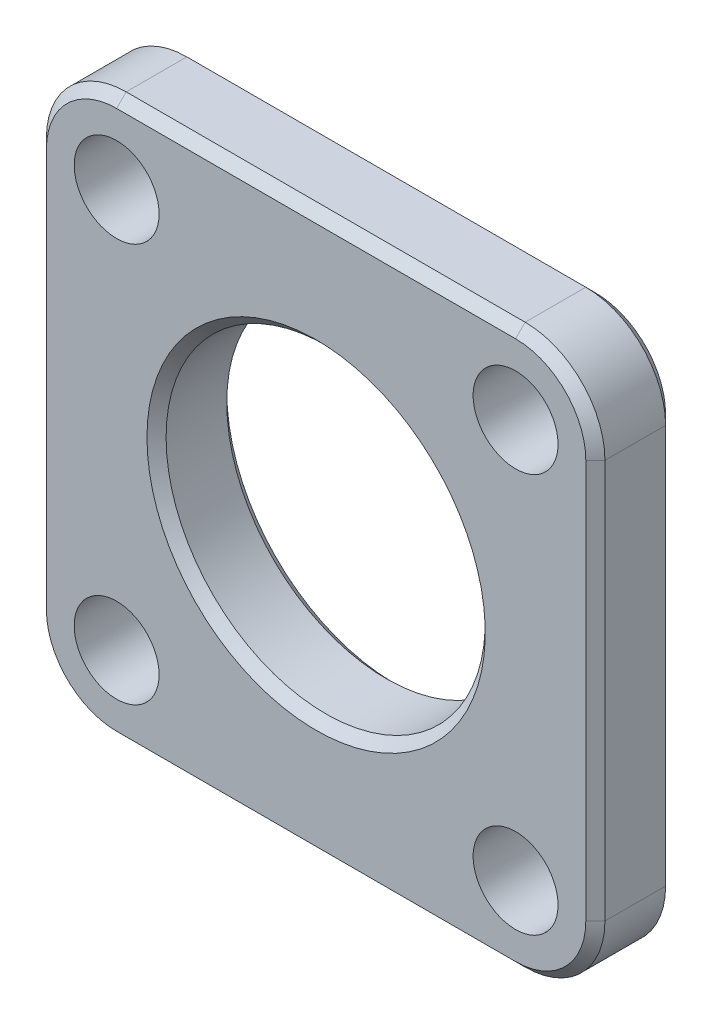
ISO-10303-21;
HEADER;
FILE_DESCRIPTION(('STEP AP214'),'2;1');
FILE_NAME('part.step','',(''),(''),'','','');
FILE_SCHEMA(('AUTOMOTIVE_DESIGN { 1 0 10303 214 1 1 1 1 }'));
ENDSEC;
DATA;
#1=APPLICATION_CONTEXT('core data for automotive mechanical design processes');
#2=APPLICATION_PROTOCOL_DEFINITION('international standard','automotive_design',2000,#1);
#3=PRODUCT_CONTEXT('',#1,'mechanical');
#4=PRODUCT('Part','Part','',(#3));
#5=PRODUCT_RELATED_PRODUCT_CATEGORY('part','',(#4));
#6=PRODUCT_DEFINITION_FORMATION('','',#4);
#7=PRODUCT_DEFINITION_CONTEXT('part definition',#1,'design');
#8=PRODUCT_DEFINITION('design','',#6,#7);
#9=PRODUCT_DEFINITION_SHAPE('','',#8);
#10=(LENGTH_UNIT() NAMED_UNIT(*) SI_UNIT(.MILLI.,.METRE.));
#11=(NAMED_UNIT(*) PLANE_ANGLE_UNIT() SI_UNIT($,.RADIAN.));
#12=(NAMED_UNIT(*) SI_UNIT($,.STERADIAN.) SOLID_ANGLE_UNIT());
#13=UNCERTAINTY_MEASURE_WITH_UNIT(LENGTH_MEASURE(1.E-05),#10,'distance_accuracy_value','');
#14=(GEOMETRIC_REPRESENTATION_CONTEXT(3) GLOBAL_UNCERTAINTY_ASSIGNED_CONTEXT((#13)) GLOBAL_UNIT_ASSIGNED_CONTEXT((#10,
#11,#12)) REPRESENTATION_CONTEXT('',''));
#15=CARTESIAN_POINT('',(0.,0.,0.));
#16=DIRECTION('',(0.,0.,1.));
#17=DIRECTION('',(1.,0.,0.));
#18=AXIS2_PLACEMENT_3D('',#15,#16,#17);
#19=CARTESIAN_POINT('',(-15.875,-15.875,6.35));
#20=DIRECTION('',(0.,0.,-1.));
#21=DIRECTION('',(-1.,0.,0.));
#22=AXIS2_PLACEMENT_3D('',#19,#20,#21);
#23=PLANE('',#22);
#24=CARTESIAN_POINT('',(-15.875,-15.875,6.35));
#25=DIRECTION('',(0.,0.,-1.));
#26=DIRECTION('',(-1.,0.,0.));
#27=AXIS2_PLACEMENT_3D('',#24,#25,#26);
#28=CIRCLE('',#27,5.588);
#29=CARTESIAN_POINT('',(-21.463,-15.875,6.35));
#30=VERTEX_POINT('',#29);
#31=CARTESIAN_POINT('',(-15.875,-21.463,6.35));
#32=VERTEX_POINT('',#31);
#33=EDGE_CURVE('E59',#30,#32,#28,.F.);
#34=ORIENTED_EDGE('',*,*,#33,.T.);
#35=DIRECTION('',(1.,0.,0.));
#36=VECTOR('',#35,1.);
#37=CARTESIAN_POINT('',(-15.875,-21.463,6.35));
#38=LINE('',#37,#36);
#39=CARTESIAN_POINT('',(15.875,-21.463,6.35));
#40=VERTEX_POINT('',#39);
#41=EDGE_CURVE('E345',#32,#40,#38,.T.);
#42=ORIENTED_EDGE('',*,*,#41,.T.);
#43=CARTESIAN_POINT('',(15.875,-15.875,6.35));
#44=DIRECTION('',(0.,0.,-1.));
#45=DIRECTION('',(-1.,0.,0.));
#46=AXIS2_PLACEMENT_3D('',#43,#44,#45);
#47=CIRCLE('',#46,5.588);
#48=CARTESIAN_POINT('',(21.463,-15.875,6.35));
#49=VERTEX_POINT('',#48);
#50=EDGE_CURVE('E181',#40,#49,#47,.F.);
#51=ORIENTED_EDGE('',*,*,#50,.T.);
#52=DIRECTION('',(0.,1.,0.));
#53=VECTOR('',#52,1.);
#54=CARTESIAN_POINT('',(21.463,-15.875,6.35));
#55=LINE('',#54,#53);
#56=CARTESIAN_POINT('',(21.463,15.875,6.35));
#57=VERTEX_POINT('',#56);
#58=EDGE_CURVE('E341',#49,#57,#55,.T.);
#59=ORIENTED_EDGE('',*,*,#58,.T.);
#60=CARTESIAN_POINT('',(15.875,15.875,6.35));
#61=DIRECTION('',(0.,0.,-1.));
#62=DIRECTION('',(-1.,0.,0.));
#63=AXIS2_PLACEMENT_3D('',#60,#61,#62);
#64=CIRCLE('',#63,5.588);
#65=CARTESIAN_POINT('',(15.875,21.463,6.35));
#66=VERTEX_POINT('',#65);
#67=EDGE_CURVE('E337',#57,#66,#64,.F.);
#68=ORIENTED_EDGE('',*,*,#67,.T.);
#69=DIRECTION('',(-1.,0.,0.));
#70=VECTOR('',#69,1.);
#71=CARTESIAN_POINT('',(-15.875,21.463,6.35));
#72=LINE('',#71,#70);
#73=CARTESIAN_POINT('',(-15.875,21.463,6.35));
#74=VERTEX_POINT('',#73);
#75=EDGE_CURVE('E333',#66,#74,#72,.T.);
#76=ORIENTED_EDGE('',*,*,#75,.T.);
#77=CARTESIAN_POINT('',(-15.875,15.875,6.35));
#78=DIRECTION('',(0.,0.,-1.));
#79=DIRECTION('',(-1.,0.,0.));
#80=AXIS2_PLACEMENT_3D('',#77,#78,#79);
#81=CIRCLE('',#80,5.588);
#82=CARTESIAN_POINT('',(-21.463,15.875,6.35));
#83=VERTEX_POINT('',#82);
#84=EDGE_CURVE('E335',#74,#83,#81,.F.);
#85=ORIENTED_EDGE('',*,*,#84,.T.);
#86=DIRECTION('',(0.,-1.,0.));
#87=VECTOR('',#86,1.);
#88=CARTESIAN_POINT('',(-21.463,-15.875,6.35));
#89=LINE('',#88,#87);
#90=EDGE_CURVE('E339',#83,#30,#89,.T.);
#91=ORIENTED_EDGE('',*,*,#90,.T.);
#92=EDGE_LOOP('',(#34,#42,#51,#59,#68,#76,#85,#91));
#93=FACE_BOUND('',#92,.T.);
#94=CARTESIAN_POINT('',(0.,0.,6.35));
#95=DIRECTION('',(0.,0.,-1.));
#96=DIRECTION('',(-1.,0.,0.));
#97=AXIS2_PLACEMENT_3D('',#94,#95,#96);
#98=CIRCLE('',#97,13.462);
#99=CARTESIAN_POINT('',(-13.462,0.,6.35));
#100=VERTEX_POINT('',#99);
#101=EDGE_CURVE('E330',#100,#100,#98,.T.);
#102=ORIENTED_EDGE('',*,*,#101,.T.);
#103=EDGE_LOOP('',(#102));
#104=FACE_BOUND('',#103,.T.);
#105=CARTESIAN_POINT('',(-15.875,15.875,6.35));
#106=DIRECTION('',(0.,0.,1.));
#107=DIRECTION('',(1.,0.,0.));
#108=AXIS2_PLACEMENT_3D('',#105,#106,#107);
#109=CIRCLE('',#108,3.37819999999999);
#110=CARTESIAN_POINT('',(-12.4968,15.875,6.35));
#111=VERTEX_POINT('',#110);
#112=EDGE_CURVE('E237',#111,#111,#109,.T.);
#113=ORIENTED_EDGE('',*,*,#112,.F.);
#114=EDGE_LOOP('',(#113));
#115=FACE_BOUND('',#114,.T.);
#116=CARTESIAN_POINT('',(15.875,-15.875,6.35));
#117=DIRECTION('',(0.,0.,1.));
#118=DIRECTION('',(1.,0.,0.));
#119=AXIS2_PLACEMENT_3D('',#116,#117,#118);
#120=CIRCLE('',#119,3.37819999999999);
#121=CARTESIAN_POINT('',(19.2532,-15.875,6.35));
#122=VERTEX_POINT('',#121);
#123=EDGE_CURVE('E248',#122,#122,#120,.T.);
#124=ORIENTED_EDGE('',*,*,#123,.F.);
#125=EDGE_LOOP('',(#124));
#126=FACE_BOUND('',#125,.T.);
#127=CARTESIAN_POINT('',(15.875,15.875,6.35));
#128=DIRECTION('',(0.,0.,1.));
#129=DIRECTION('',(1.,0.,0.));
#130=AXIS2_PLACEMENT_3D('',#127,#128,#129);
#131=CIRCLE('',#130,3.37819999999999);
#132=CARTESIAN_POINT('',(19.2532,15.875,6.35));
#133=VERTEX_POINT('',#132);
#134=EDGE_CURVE('E256',#133,#133,#131,.T.);
#135=ORIENTED_EDGE('',*,*,#134,.F.);
#136=EDGE_LOOP('',(#135));
#137=FACE_BOUND('',#136,.T.);
#138=CARTESIAN_POINT('',(-15.875,-15.875,6.35));
#139=DIRECTION('',(0.,0.,1.));
#140=DIRECTION('',(1.,0.,0.));
#141=AXIS2_PLACEMENT_3D('',#138,#139,#140);
#142=CIRCLE('',#141,3.37819999999999);
#143=CARTESIAN_POINT('',(-12.4968,-15.875,6.35));
#144=VERTEX_POINT('',#143);
#145=EDGE_CURVE('E262',#144,#144,#142,.T.);
#146=ORIENTED_EDGE('',*,*,#145,.F.);
#147=EDGE_LOOP('',(#146));
#148=FACE_BOUND('',#147,.T.);
#149=ADVANCED_FACE('F34',(#93,#104,#115,#126,#137,#148),#23,.F.);
#150=CARTESIAN_POINT('',(-15.875,-15.875,0.));
#151=DIRECTION('',(0.,0.,-1.));
#152=DIRECTION('',(-1.,0.,0.));
#153=AXIS2_PLACEMENT_3D('',#150,#151,#152);
#154=PLANE('',#153);
#155=CARTESIAN_POINT('',(15.875,-15.875,0.));
#156=DIRECTION('',(0.,0.,-1.));
#157=DIRECTION('',(-1.,0.,0.));
#158=AXIS2_PLACEMENT_3D('',#155,#156,#157);
#159=CIRCLE('',#158,5.588);
#160=CARTESIAN_POINT('',(21.463,-15.875,0.));
#161=VERTEX_POINT('',#160);
#162=CARTESIAN_POINT('',(15.875,-21.463,0.));
#163=VERTEX_POINT('',#162);
#164=EDGE_CURVE('E301',#161,#163,#159,.T.);
#165=ORIENTED_EDGE('',*,*,#164,.T.);
#166=DIRECTION('',(-1.,0.,0.));
#167=VECTOR('',#166,1.);
#168=CARTESIAN_POINT('',(-15.875,-21.463,0.));
#169=LINE('',#168,#167);
#170=CARTESIAN_POINT('',(-15.875,-21.463,0.));
#171=VERTEX_POINT('',#170);
#172=EDGE_CURVE('E163',#163,#171,#169,.T.);
#173=ORIENTED_EDGE('',*,*,#172,.T.);
#174=CARTESIAN_POINT('',(-15.875,-15.875,0.));
#175=DIRECTION('',(0.,0.,-1.));
#176=DIRECTION('',(-1.,0.,0.));
#177=AXIS2_PLACEMENT_3D('',#174,#175,#176);
#178=CIRCLE('',#177,5.588);
#179=CARTESIAN_POINT('',(-21.463,-15.875,0.));
#180=VERTEX_POINT('',#179);
#181=EDGE_CURVE('E299',#171,#180,#178,.T.);
#182=ORIENTED_EDGE('',*,*,#181,.T.);
#183=DIRECTION('',(0.,1.,0.));
#184=VECTOR('',#183,1.);
#185=CARTESIAN_POINT('',(-21.463,15.875,0.));
#186=LINE('',#185,#184);
#187=CARTESIAN_POINT('',(-21.463,15.875,0.));
#188=VERTEX_POINT('',#187);
#189=EDGE_CURVE('E295',#180,#188,#186,.T.);
#190=ORIENTED_EDGE('',*,*,#189,.T.);
#191=CARTESIAN_POINT('',(-15.875,15.875,0.));
#192=DIRECTION('',(0.,0.,-1.));
#193=DIRECTION('',(-1.,0.,0.));
#194=AXIS2_PLACEMENT_3D('',#191,#192,#193);
#195=CIRCLE('',#194,5.588);
#196=CARTESIAN_POINT('',(-15.875,21.463,0.));
#197=VERTEX_POINT('',#196);
#198=EDGE_CURVE('E291',#188,#197,#195,.T.);
#199=ORIENTED_EDGE('',*,*,#198,.T.);
#200=DIRECTION('',(1.,0.,0.));
#201=VECTOR('',#200,1.);
#202=CARTESIAN_POINT('',(15.875,21.463,0.));
#203=LINE('',#202,#201);
#204=CARTESIAN_POINT('',(15.875,21.463,0.));
#205=VERTEX_POINT('',#204);
#206=EDGE_CURVE('E289',#197,#205,#203,.T.);
#207=ORIENTED_EDGE('',*,*,#206,.T.);
#208=CARTESIAN_POINT('',(15.875,15.875,0.));
#209=DIRECTION('',(0.,0.,-1.));
#210=DIRECTION('',(-1.,0.,0.));
#211=AXIS2_PLACEMENT_3D('',#208,#209,#210);
#212=CIRCLE('',#211,5.588);
#213=CARTESIAN_POINT('',(21.463,15.875,0.));
#214=VERTEX_POINT('',#213);
#215=EDGE_CURVE('E293',#205,#214,#212,.T.);
#216=ORIENTED_EDGE('',*,*,#215,.T.);
#217=DIRECTION('',(0.,-1.,0.));
#218=VECTOR('',#217,1.);
#219=CARTESIAN_POINT('',(21.463,-15.875,0.));
#220=LINE('',#219,#218);
#221=EDGE_CURVE('E297',#214,#161,#220,.T.);
#222=ORIENTED_EDGE('',*,*,#221,.T.);
#223=EDGE_LOOP('',(#165,#173,#182,#190,#199,#207,#216,#222));
#224=FACE_BOUND('',#223,.T.);
#225=CARTESIAN_POINT('',(0.,0.,0.));
#226=DIRECTION('',(0.,0.,-1.));
#227=DIRECTION('',(-1.,0.,0.));
#228=AXIS2_PLACEMENT_3D('',#225,#226,#227);
#229=CIRCLE('',#228,13.462);
#230=CARTESIAN_POINT('',(-13.462,0.,0.));
#231=VERTEX_POINT('',#230);
#232=EDGE_CURVE('E286',#231,#231,#229,.F.);
#233=ORIENTED_EDGE('',*,*,#232,.T.);
#234=EDGE_LOOP('',(#233));
#235=FACE_BOUND('',#234,.T.);
#236=CARTESIAN_POINT('',(-15.875,15.875,0.));
#237=DIRECTION('',(0.,0.,1.));
#238=DIRECTION('',(1.,0.,0.));
#239=AXIS2_PLACEMENT_3D('',#236,#237,#238);
#240=CIRCLE('',#239,3.37819999999999);
#241=CARTESIAN_POINT('',(-12.4968,15.875,0.));
#242=VERTEX_POINT('',#241);
#243=EDGE_CURVE('E243',#242,#242,#240,.T.);
#244=ORIENTED_EDGE('',*,*,#243,.T.);
#245=EDGE_LOOP('',(#244));
#246=FACE_BOUND('',#245,.T.);
#247=CARTESIAN_POINT('',(15.875,-15.875,0.));
#248=DIRECTION('',(0.,0.,1.));
#249=DIRECTION('',(1.,0.,0.));
#250=AXIS2_PLACEMENT_3D('',#247,#248,#249);
#251=CIRCLE('',#250,3.37819999999999);
#252=CARTESIAN_POINT('',(19.2532,-15.875,0.));
#253=VERTEX_POINT('',#252);
#254=EDGE_CURVE('E253',#253,#253,#251,.T.);
#255=ORIENTED_EDGE('',*,*,#254,.T.);
#256=EDGE_LOOP('',(#255));
#257=FACE_BOUND('',#256,.T.);
#258=CARTESIAN_POINT('',(15.875,15.875,0.));
#259=DIRECTION('',(0.,0.,1.));
#260=DIRECTION('',(1.,0.,0.));
#261=AXIS2_PLACEMENT_3D('',#258,#259,#260);
#262=CIRCLE('',#261,3.37819999999999);
#263=CARTESIAN_POINT('',(19.2532,15.875,0.));
#264=VERTEX_POINT('',#263);
#265=EDGE_CURVE('E259',#264,#264,#262,.T.);
#266=ORIENTED_EDGE('',*,*,#265,.T.);
#267=EDGE_LOOP('',(#266));
#268=FACE_BOUND('',#267,.T.);
#269=CARTESIAN_POINT('',(-15.875,-15.875,0.));
#270=DIRECTION('',(0.,0.,1.));
#271=DIRECTION('',(1.,0.,0.));
#272=AXIS2_PLACEMENT_3D('',#269,#270,#271);
#273=CIRCLE('',#272,3.37819999999999);
#274=CARTESIAN_POINT('',(-12.4968,-15.875,0.));
#275=VERTEX_POINT('',#274);
#276=EDGE_CURVE('E265',#275,#275,#273,.T.);
#277=ORIENTED_EDGE('',*,*,#276,.T.);
#278=EDGE_LOOP('',(#277));
#279=FACE_BOUND('',#278,.T.);
#280=ADVANCED_FACE('F360',(#224,#235,#246,#257,#268,#279),#154,.T.);
#281=CARTESIAN_POINT('',(-15.875,-15.875,6.35));
#282=DIRECTION('',(0.,0.,-1.));
#283=DIRECTION('',(-1.,0.,0.));
#284=AXIS2_PLACEMENT_3D('',#281,#282,#283);
#285=CYLINDRICAL_SURFACE('',#284,6.35);
#286=DIRECTION('',(0.,0.,-1.));
#287=VECTOR('',#286,1.);
#288=CARTESIAN_POINT('',(-22.225,-15.875,6.35));
#289=LINE('',#288,#287);
#290=CARTESIAN_POINT('',(-22.225,-15.875,5.588));
#291=VERTEX_POINT('',#290);
#292=CARTESIAN_POINT('',(-22.225,-15.875,0.761999999999999));
#293=VERTEX_POINT('',#292);
#294=EDGE_CURVE('E268',#291,#293,#289,.T.);
#295=ORIENTED_EDGE('',*,*,#294,.T.);
#296=CARTESIAN_POINT('',(-15.875,-15.875,0.761999999999999));
#297=DIRECTION('',(0.,0.,-1.));
#298=DIRECTION('',(-1.,0.,0.));
#299=AXIS2_PLACEMENT_3D('',#296,#297,#298);
#300=CIRCLE('',#299,6.35);
#301=CARTESIAN_POINT('',(-15.875,-22.225,0.761999999999999));
#302=VERTEX_POINT('',#301);
#303=EDGE_CURVE('E308',#293,#302,#300,.F.);
#304=ORIENTED_EDGE('',*,*,#303,.T.);
#305=DIRECTION('',(0.,0.,-1.));
#306=VECTOR('',#305,1.);
#307=CARTESIAN_POINT('',(-15.875,-22.225,6.35));
#308=LINE('',#307,#306);
#309=CARTESIAN_POINT('',(-15.875,-22.225,5.588));
#310=VERTEX_POINT('',#309);
#311=EDGE_CURVE('E174',#310,#302,#308,.T.);
#312=ORIENTED_EDGE('',*,*,#311,.F.);
#313=CARTESIAN_POINT('',(-15.875,-15.875,5.588));
#314=DIRECTION('',(0.,0.,-1.));
#315=DIRECTION('',(-1.,0.,0.));
#316=AXIS2_PLACEMENT_3D('',#313,#314,#315);
#317=CIRCLE('',#316,6.35);
#318=EDGE_CURVE('E306',#310,#291,#317,.T.);
#319=ORIENTED_EDGE('',*,*,#318,.T.);
#320=EDGE_LOOP('',(#295,#304,#312,#319));
#321=FACE_BOUND('',#320,.T.);
#322=ADVANCED_FACE('F365',(#321),#285,.T.);
#323=CARTESIAN_POINT('',(-15.875,-22.225,6.35));
#324=DIRECTION('',(0.,1.,0.));
#325=DIRECTION('',(0.,0.,1.));
#326=AXIS2_PLACEMENT_3D('',#323,#324,#325);
#327=PLANE('',#326);
#328=ORIENTED_EDGE('',*,*,#311,.T.);
#329=DIRECTION('',(1.,0.,0.));
#330=VECTOR('',#329,1.);
#331=CARTESIAN_POINT('',(15.875,-22.225,0.761999999999999));
#332=LINE('',#331,#330);
#333=CARTESIAN_POINT('',(15.875,-22.225,0.761999999999999));
#334=VERTEX_POINT('',#333);
#335=EDGE_CURVE('E173',#302,#334,#332,.T.);
#336=ORIENTED_EDGE('',*,*,#335,.T.);
#337=DIRECTION('',(0.,0.,-1.));
#338=VECTOR('',#337,1.);
#339=CARTESIAN_POINT('',(15.875,-22.225,6.35));
#340=LINE('',#339,#338);
#341=CARTESIAN_POINT('',(15.875,-22.225,5.588));
#342=VERTEX_POINT('',#341);
#343=EDGE_CURVE('E156',#342,#334,#340,.T.);
#344=ORIENTED_EDGE('',*,*,#343,.F.);
#345=DIRECTION('',(-1.,0.,0.));
#346=VECTOR('',#345,1.);
#347=CARTESIAN_POINT('',(-15.875,-22.225,5.588));
#348=LINE('',#347,#346);
#349=EDGE_CURVE('E170',#342,#310,#348,.T.);
#350=ORIENTED_EDGE('',*,*,#349,.T.);
#351=EDGE_LOOP('',(#328,#336,#344,#350));
#352=FACE_BOUND('',#351,.T.);
#353=ADVANCED_FACE('F169',(#352),#327,.F.);
#354=CARTESIAN_POINT('',(15.875,-15.875,6.35));
#355=DIRECTION('',(0.,0.,-1.));
#356=DIRECTION('',(-1.,0.,0.));
#357=AXIS2_PLACEMENT_3D('',#354,#355,#356);
#358=CYLINDRICAL_SURFACE('',#357,6.35);
#359=ORIENTED_EDGE('',*,*,#343,.T.);
#360=CARTESIAN_POINT('',(15.875,-15.875,0.761999999999999));
#361=DIRECTION('',(0.,0.,-1.));
#362=DIRECTION('',(-1.,0.,0.));
#363=AXIS2_PLACEMENT_3D('',#360,#361,#362);
#364=CIRCLE('',#363,6.35);
#365=CARTESIAN_POINT('',(22.225,-15.875,0.761999999999999));
#366=VERTEX_POINT('',#365);
#367=EDGE_CURVE('E162',#334,#366,#364,.F.);
#368=ORIENTED_EDGE('',*,*,#367,.T.);
#369=DIRECTION('',(0.,0.,-1.));
#370=VECTOR('',#369,1.);
#371=CARTESIAN_POINT('',(22.225,-15.875,6.35));
#372=LINE('',#371,#370);
#373=CARTESIAN_POINT('',(22.225,-15.875,5.588));
#374=VERTEX_POINT('',#373);
#375=EDGE_CURVE('E158',#374,#366,#372,.T.);
#376=ORIENTED_EDGE('',*,*,#375,.F.);
#377=CARTESIAN_POINT('',(15.875,-15.875,5.588));
#378=DIRECTION('',(0.,0.,-1.));
#379=DIRECTION('',(-1.,0.,0.));
#380=AXIS2_PLACEMENT_3D('',#377,#378,#379);
#381=CIRCLE('',#380,6.35);
#382=EDGE_CURVE('E153',#374,#342,#381,.T.);
#383=ORIENTED_EDGE('',*,*,#382,.T.);
#384=EDGE_LOOP('',(#359,#368,#376,#383));
#385=FACE_BOUND('',#384,.T.);
#386=ADVANCED_FACE('F155',(#385),#358,.T.);
#387=CARTESIAN_POINT('',(22.225,-15.875,6.35));
#388=DIRECTION('',(-1.,0.,0.));
#389=DIRECTION('',(0.,0.,1.));
#390=AXIS2_PLACEMENT_3D('',#387,#388,#389);
#391=PLANE('',#390);
#392=ORIENTED_EDGE('',*,*,#375,.T.);
#393=DIRECTION('',(0.,1.,0.));
#394=VECTOR('',#393,1.);
#395=CARTESIAN_POINT('',(22.225,15.875,0.761999999999999));
#396=LINE('',#395,#394);
#397=CARTESIAN_POINT('',(22.225,15.875,0.761999999999999));
#398=VERTEX_POINT('',#397);
#399=EDGE_CURVE('E312',#366,#398,#396,.T.);
#400=ORIENTED_EDGE('',*,*,#399,.T.);
#401=DIRECTION('',(0.,0.,-1.));
#402=VECTOR('',#401,1.);
#403=CARTESIAN_POINT('',(22.225,15.875,6.35));
#404=LINE('',#403,#402);
#405=CARTESIAN_POINT('',(22.225,15.875,5.588));
#406=VERTEX_POINT('',#405);
#407=EDGE_CURVE('E280',#406,#398,#404,.T.);
#408=ORIENTED_EDGE('',*,*,#407,.F.);
#409=DIRECTION('',(0.,-1.,0.));
#410=VECTOR('',#409,1.);
#411=CARTESIAN_POINT('',(22.225,-15.875,5.588));
#412=LINE('',#411,#410);
#413=EDGE_CURVE('E310',#406,#374,#412,.T.);
#414=ORIENTED_EDGE('',*,*,#413,.T.);
#415=EDGE_LOOP('',(#392,#400,#408,#414));
#416=FACE_BOUND('',#415,.T.);
#417=ADVANCED_FACE('F387',(#416),#391,.F.);
#418=CARTESIAN_POINT('',(15.875,15.875,6.35));
#419=DIRECTION('',(0.,0.,-1.));
#420=DIRECTION('',(-1.,0.,0.));
#421=AXIS2_PLACEMENT_3D('',#418,#419,#420);
#422=CYLINDRICAL_SURFACE('',#421,6.35);
#423=ORIENTED_EDGE('',*,*,#407,.T.);
#424=CARTESIAN_POINT('',(15.875,15.875,0.761999999999999));
#425=DIRECTION('',(0.,0.,-1.));
#426=DIRECTION('',(-1.,0.,0.));
#427=AXIS2_PLACEMENT_3D('',#424,#425,#426);
#428=CIRCLE('',#427,6.35);
#429=CARTESIAN_POINT('',(15.875,22.225,0.761999999999999));
#430=VERTEX_POINT('',#429);
#431=EDGE_CURVE('E320',#398,#430,#428,.F.);
#432=ORIENTED_EDGE('',*,*,#431,.T.);
#433=DIRECTION('',(0.,0.,-1.));
#434=VECTOR('',#433,1.);
#435=CARTESIAN_POINT('',(15.875,22.225,6.35));
#436=LINE('',#435,#434);
#437=CARTESIAN_POINT('',(15.875,22.225,5.588));
#438=VERTEX_POINT('',#437);
#439=EDGE_CURVE('E277',#438,#430,#436,.T.);
#440=ORIENTED_EDGE('',*,*,#439,.F.);
#441=CARTESIAN_POINT('',(15.875,15.875,5.588));
#442=DIRECTION('',(0.,0.,-1.));
#443=DIRECTION('',(-1.,0.,0.));
#444=AXIS2_PLACEMENT_3D('',#441,#442,#443);
#445=CIRCLE('',#444,6.35);
#446=EDGE_CURVE('E318',#438,#406,#445,.T.);
#447=ORIENTED_EDGE('',*,*,#446,.T.);
#448=EDGE_LOOP('',(#423,#432,#440,#447));
#449=FACE_BOUND('',#448,.T.);
#450=ADVANCED_FACE('F383',(#449),#422,.T.);
#451=CARTESIAN_POINT('',(-15.875,22.225,6.35));
#452=DIRECTION('',(0.,-1.,0.));
#453=DIRECTION('',(0.,0.,-1.));
#454=AXIS2_PLACEMENT_3D('',#451,#452,#453);
#455=PLANE('',#454);
#456=ORIENTED_EDGE('',*,*,#439,.T.);
#457=DIRECTION('',(-1.,0.,0.));
#458=VECTOR('',#457,1.);
#459=CARTESIAN_POINT('',(-15.875,22.225,0.761999999999999));
#460=LINE('',#459,#458);
#461=CARTESIAN_POINT('',(-15.875,22.225,0.761999999999999));
#462=VERTEX_POINT('',#461);
#463=EDGE_CURVE('E328',#430,#462,#460,.T.);
#464=ORIENTED_EDGE('',*,*,#463,.T.);
#465=DIRECTION('',(0.,0.,-1.));
#466=VECTOR('',#465,1.);
#467=CARTESIAN_POINT('',(-15.875,22.225,6.35));
#468=LINE('',#467,#466);
#469=CARTESIAN_POINT('',(-15.875,22.225,5.588));
#470=VERTEX_POINT('',#469);
#471=EDGE_CURVE('E274',#470,#462,#468,.T.);
#472=ORIENTED_EDGE('',*,*,#471,.F.);
#473=DIRECTION('',(1.,0.,0.));
#474=VECTOR('',#473,1.);
#475=CARTESIAN_POINT('',(-15.875,22.225,5.588));
#476=LINE('',#475,#474);
#477=EDGE_CURVE('E326',#470,#438,#476,.T.);
#478=ORIENTED_EDGE('',*,*,#477,.T.);
#479=EDGE_LOOP('',(#456,#464,#472,#478));
#480=FACE_BOUND('',#479,.T.);
#481=ADVANCED_FACE('F379',(#480),#455,.F.);
#482=CARTESIAN_POINT('',(-15.875,15.875,6.35));
#483=DIRECTION('',(0.,0.,-1.));
#484=DIRECTION('',(-1.,0.,0.));
#485=AXIS2_PLACEMENT_3D('',#482,#483,#484);
#486=CYLINDRICAL_SURFACE('',#485,6.35);
#487=ORIENTED_EDGE('',*,*,#471,.T.);
#488=CARTESIAN_POINT('',(-15.875,15.875,0.761999999999999));
#489=DIRECTION('',(0.,0.,-1.));
#490=DIRECTION('',(-1.,0.,0.));
#491=AXIS2_PLACEMENT_3D('',#488,#489,#490);
#492=CIRCLE('',#491,6.35);
#493=CARTESIAN_POINT('',(-22.225,15.875,0.761999999999999));
#494=VERTEX_POINT('',#493);
#495=EDGE_CURVE('E324',#462,#494,#492,.F.);
#496=ORIENTED_EDGE('',*,*,#495,.T.);
#497=DIRECTION('',(0.,0.,-1.));
#498=VECTOR('',#497,1.);
#499=CARTESIAN_POINT('',(-22.225,15.875,6.35));
#500=LINE('',#499,#498);
#501=CARTESIAN_POINT('',(-22.225,15.875,5.588));
#502=VERTEX_POINT('',#501);
#503=EDGE_CURVE('E271',#502,#494,#500,.T.);
#504=ORIENTED_EDGE('',*,*,#503,.F.);
#505=CARTESIAN_POINT('',(-15.875,15.875,5.588));
#506=DIRECTION('',(0.,0.,-1.));
#507=DIRECTION('',(-1.,0.,0.));
#508=AXIS2_PLACEMENT_3D('',#505,#506,#507);
#509=CIRCLE('',#508,6.35);
#510=EDGE_CURVE('E322',#502,#470,#509,.T.);
#511=ORIENTED_EDGE('',*,*,#510,.T.);
#512=EDGE_LOOP('',(#487,#496,#504,#511));
#513=FACE_BOUND('',#512,.T.);
#514=ADVANCED_FACE('F375',(#513),#486,.T.);
#515=CARTESIAN_POINT('',(-22.225,-15.875,6.35));
#516=DIRECTION('',(1.,0.,0.));
#517=DIRECTION('',(0.,0.,-1.));
#518=AXIS2_PLACEMENT_3D('',#515,#516,#517);
#519=PLANE('',#518);
#520=ORIENTED_EDGE('',*,*,#503,.T.);
#521=DIRECTION('',(0.,-1.,0.));
#522=VECTOR('',#521,1.);
#523=CARTESIAN_POINT('',(-22.225,-15.875,0.761999999999999));
#524=LINE('',#523,#522);
#525=EDGE_CURVE('E316',#494,#293,#524,.T.);
#526=ORIENTED_EDGE('',*,*,#525,.T.);
#527=ORIENTED_EDGE('',*,*,#294,.F.);
#528=DIRECTION('',(0.,1.,0.));
#529=VECTOR('',#528,1.);
#530=CARTESIAN_POINT('',(-22.225,-15.875,5.588));
#531=LINE('',#530,#529);
#532=EDGE_CURVE('E314',#291,#502,#531,.T.);
#533=ORIENTED_EDGE('',*,*,#532,.T.);
#534=EDGE_LOOP('',(#520,#526,#527,#533));
#535=FACE_BOUND('',#534,.T.);
#536=ADVANCED_FACE('F372',(#535),#519,.F.);
#537=CARTESIAN_POINT('',(0.,0.,6.35));
#538=DIRECTION('',(0.,0.,-1.));
#539=DIRECTION('',(-1.,0.,0.));
#540=AXIS2_PLACEMENT_3D('',#537,#538,#539);
#541=CYLINDRICAL_SURFACE('',#540,12.7);
#542=CARTESIAN_POINT('',(0.,0.,0.762000000000001));
#543=DIRECTION('',(0.,0.,-1.));
#544=DIRECTION('',(-1.,0.,0.));
#545=AXIS2_PLACEMENT_3D('',#542,#543,#544);
#546=CIRCLE('',#545,12.7);
#547=CARTESIAN_POINT('',(-12.7,0.,0.762000000000001));
#548=VERTEX_POINT('',#547);
#549=EDGE_CURVE('E11',#548,#548,#546,.T.);
#550=CARTESIAN_POINT('',(0.,0.,5.58799999999999));
#551=DIRECTION('',(0.,0.,-1.));
#552=DIRECTION('',(-1.,0.,0.));
#553=AXIS2_PLACEMENT_3D('',#550,#551,#552);
#554=CIRCLE('',#553,12.7);
#555=CARTESIAN_POINT('',(-12.7,0.,5.58799999999999));
#556=VERTEX_POINT('',#555);
#557=EDGE_CURVE('E43',#556,#556,#554,.F.);
#558=CARTESIAN_POINT('',(-12.7,0.,0.762000000000001));
#559=CARTESIAN_POINT('',(-12.7,0.,0.812270833333334));
#560=CARTESIAN_POINT('',(-12.7,0.,0.862541666666667));
#561=CARTESIAN_POINT('',(-12.7,0.,0.963083333333334));
#562=CARTESIAN_POINT('',(-12.7,0.,1.01335416666667));
#563=CARTESIAN_POINT('',(-12.7,0.,1.11389583333333));
#564=CARTESIAN_POINT('',(-12.7,0.,1.16416666666667));
#565=CARTESIAN_POINT('',(-12.7,0.,1.26470833333333));
#566=CARTESIAN_POINT('',(-12.7,0.,1.31497916666667));
#567=CARTESIAN_POINT('',(-12.7,0.,1.41552083333333));
#568=CARTESIAN_POINT('',(-12.7,0.,1.46579166666667));
#569=CARTESIAN_POINT('',(-12.7,0.,1.56633333333333));
#570=CARTESIAN_POINT('',(-12.7,0.,1.61660416666666));
#571=CARTESIAN_POINT('',(-12.7,0.,1.71714583333333));
#572=CARTESIAN_POINT('',(-12.7,0.,1.76741666666666));
#573=CARTESIAN_POINT('',(-12.7,0.,1.86795833333333));
#574=CARTESIAN_POINT('',(-12.7,0.,1.91822916666666));
#575=CARTESIAN_POINT('',(-12.7,0.,2.01877083333333));
#576=CARTESIAN_POINT('',(-12.7,0.,2.06904166666666));
#577=CARTESIAN_POINT('',(-12.7,0.,2.16958333333333));
#578=CARTESIAN_POINT('',(-12.7,0.,2.21985416666666));
#579=CARTESIAN_POINT('',(-12.7,0.,2.32039583333333));
#580=CARTESIAN_POINT('',(-12.7,0.,2.37066666666666));
#581=CARTESIAN_POINT('',(-12.7,0.,2.47120833333333));
#582=CARTESIAN_POINT('',(-12.7,0.,2.52147916666666));
#583=CARTESIAN_POINT('',(-12.7,0.,2.62202083333333));
#584=CARTESIAN_POINT('',(-12.7,0.,2.67229166666666));
#585=CARTESIAN_POINT('',(-12.7,0.,2.77283333333333));
#586=CARTESIAN_POINT('',(-12.7,0.,2.82310416666666));
#587=CARTESIAN_POINT('',(-12.7,0.,2.92364583333333));
#588=CARTESIAN_POINT('',(-12.7,0.,2.97391666666666));
#589=CARTESIAN_POINT('',(-12.7,0.,3.07445833333333));
#590=CARTESIAN_POINT('',(-12.7,0.,3.12472916666666));
#591=CARTESIAN_POINT('',(-12.7,0.,3.22527083333333));
#592=CARTESIAN_POINT('',(-12.7,0.,3.27554166666666));
#593=CARTESIAN_POINT('',(-12.7,0.,3.37608333333333));
#594=CARTESIAN_POINT('',(-12.7,0.,3.42635416666666));
#595=CARTESIAN_POINT('',(-12.7,0.,3.52689583333333));
#596=CARTESIAN_POINT('',(-12.7,0.,3.57716666666666));
#597=CARTESIAN_POINT('',(-12.7,0.,3.67770833333333));
#598=CARTESIAN_POINT('',(-12.7,0.,3.72797916666666));
#599=CARTESIAN_POINT('',(-12.7,0.,3.82852083333333));
#600=CARTESIAN_POINT('',(-12.7,0.,3.87879166666666));
#601=CARTESIAN_POINT('',(-12.7,0.,3.97933333333333));
#602=CARTESIAN_POINT('',(-12.7,0.,4.02960416666666));
#603=CARTESIAN_POINT('',(-12.7,0.,4.13014583333332));
#604=CARTESIAN_POINT('',(-12.7,0.,4.18041666666666));
#605=CARTESIAN_POINT('',(-12.7,0.,4.28095833333332));
#606=CARTESIAN_POINT('',(-12.7,0.,4.33122916666666));
#607=CARTESIAN_POINT('',(-12.7,0.,4.43177083333332));
#608=CARTESIAN_POINT('',(-12.7,0.,4.48204166666666));
#609=CARTESIAN_POINT('',(-12.7,0.,4.58258333333332));
#610=CARTESIAN_POINT('',(-12.7,0.,4.63285416666666));
#611=CARTESIAN_POINT('',(-12.7,0.,4.73339583333332));
#612=CARTESIAN_POINT('',(-12.7,0.,4.78366666666666));
#613=CARTESIAN_POINT('',(-12.7,0.,4.88420833333332));
#614=CARTESIAN_POINT('',(-12.7,0.,4.93447916666666));
#615=CARTESIAN_POINT('',(-12.7,0.,5.03502083333332));
#616=CARTESIAN_POINT('',(-12.7,0.,5.08529166666666));
#617=CARTESIAN_POINT('',(-12.7,0.,5.18583333333332));
#618=CARTESIAN_POINT('',(-12.7,0.,5.23610416666665));
#619=CARTESIAN_POINT('',(-12.7,0.,5.33664583333332));
#620=CARTESIAN_POINT('',(-12.7,0.,5.38691666666665));
#621=CARTESIAN_POINT('',(-12.7,0.,5.48745833333332));
#622=CARTESIAN_POINT('',(-12.7,0.,5.53772916666665));
#623=CARTESIAN_POINT('',(-12.7,0.,5.58799999999999));
#624=B_SPLINE_CURVE_WITH_KNOTS('',3,(#558,#559,#560,#561,#562,#563,#564,#565,#566,#567,#568,
#569,#570,#571,#572,#573,#574,#575,#576,#577,#578,#579,#580,#581,#582,#583,#584,#585,#586,#587,
#588,#589,#590,#591,#592,#593,#594,#595,#596,#597,#598,#599,#600,#601,#602,#603,#604,#605,#606,
#607,#608,#609,#610,#611,#612,#613,#614,#615,#616,#617,#618,#619,#620,#621,#622,#623),
.UNSPECIFIED.,.F.,.F.,(4,2,2,2,2,2,2,2,2,2,2,2,2,2,2,2,2,2,2,2,2,2,2,2,2,2,2,2,2,2,2,2,4),(0.,
0.1508125,0.301624999999999,0.452437499999999,0.603249999999998,0.754062499999998,
0.904874999999998,1.0556875,1.2065,1.3573125,1.508125,1.6589375,1.80974999999999,
1.96056249999999,2.11137499999999,2.26218749999999,2.41299999999999,2.56381249999999,
2.71462499999999,2.86543749999999,3.01624999999999,3.16706249999999,3.31787499999999,
3.46868749999999,3.61949999999999,3.77031249999999,3.92112499999999,4.07193749999999,
4.22274999999999,4.37356249999999,4.52437499999999,4.67518749999999,4.82599999999999),.UNSPECIFIED.);
#625=EDGE_CURVE('BSEAM349',#548,#556,#624,.T.);
#626=ORIENTED_EDGE('',*,*,#549,.T.);
#627=ORIENTED_EDGE('',*,*,#557,.T.);
#628=ORIENTED_EDGE('',*,*,#625,.T.);
#629=ORIENTED_EDGE('',*,*,#625,.F.);
#630=EDGE_LOOP('',(#626,#628,#627,#629));
#631=FACE_BOUND('',#630,.T.);
#632=ADVANCED_FACE('F349',(#631),#541,.F.);
#633=CARTESIAN_POINT('',(-15.875,-15.875,6.35));
#634=DIRECTION('',(0.,0.,1.));
#635=DIRECTION('',(1.,0.,0.));
#636=AXIS2_PLACEMENT_3D('',#633,#634,#635);
#637=CYLINDRICAL_SURFACE('',#636,3.37819999999999);
#638=ORIENTED_EDGE('',*,*,#276,.F.);
#639=EDGE_LOOP('',(#638));
#640=FACE_BOUND('',#639,.T.);
#641=ORIENTED_EDGE('',*,*,#145,.T.);
#642=EDGE_LOOP('',(#641));
#643=FACE_BOUND('',#642,.T.);
#644=ADVANCED_FACE('F495',(#640,#643),#637,.F.);
#645=CARTESIAN_POINT('',(15.875,15.875,6.35));
#646=DIRECTION('',(0.,0.,1.));
#647=DIRECTION('',(1.,0.,0.));
#648=AXIS2_PLACEMENT_3D('',#645,#646,#647);
#649=CYLINDRICAL_SURFACE('',#648,3.37819999999999);
#650=ORIENTED_EDGE('',*,*,#265,.F.);
#651=EDGE_LOOP('',(#650));
#652=FACE_BOUND('',#651,.T.);
#653=ORIENTED_EDGE('',*,*,#134,.T.);
#654=EDGE_LOOP('',(#653));
#655=FACE_BOUND('',#654,.T.);
#656=ADVANCED_FACE('F498',(#652,#655),#649,.F.);
#657=CARTESIAN_POINT('',(15.875,-15.875,6.35));
#658=DIRECTION('',(0.,0.,1.));
#659=DIRECTION('',(1.,0.,0.));
#660=AXIS2_PLACEMENT_3D('',#657,#658,#659);
#661=CYLINDRICAL_SURFACE('',#660,3.37819999999999);
#662=ORIENTED_EDGE('',*,*,#254,.F.);
#663=EDGE_LOOP('',(#662));
#664=FACE_BOUND('',#663,.T.);
#665=ORIENTED_EDGE('',*,*,#123,.T.);
#666=EDGE_LOOP('',(#665));
#667=FACE_BOUND('',#666,.T.);
#668=ADVANCED_FACE('F505',(#664,#667),#661,.F.);
#669=CARTESIAN_POINT('',(-15.875,15.875,6.35));
#670=DIRECTION('',(0.,0.,1.));
#671=DIRECTION('',(1.,0.,0.));
#672=AXIS2_PLACEMENT_3D('',#669,#670,#671);
#673=CYLINDRICAL_SURFACE('',#672,3.37819999999999);
#674=ORIENTED_EDGE('',*,*,#243,.F.);
#675=EDGE_LOOP('',(#674));
#676=FACE_BOUND('',#675,.T.);
#677=ORIENTED_EDGE('',*,*,#112,.T.);
#678=EDGE_LOOP('',(#677));
#679=FACE_BOUND('',#678,.T.);
#680=ADVANCED_FACE('F428',(#676,#679),#673,.F.);
#681=CARTESIAN_POINT('',(-15.875,22.225,0.761999999999999));
#682=DIRECTION('',(0.,0.707106781186548,-0.707106781186548));
#683=DIRECTION('',(1.,0.,0.));
#684=AXIS2_PLACEMENT_3D('',#681,#682,#683);
#685=PLANE('',#684);
#686=DIRECTION('',(0.,0.707106781186548,0.707106781186548));
#687=VECTOR('',#686,1.);
#688=CARTESIAN_POINT('',(15.875,21.463,0.));
#689=LINE('',#688,#687);
#690=EDGE_CURVE('E230',#205,#430,#689,.T.);
#691=ORIENTED_EDGE('',*,*,#690,.F.);
#692=ORIENTED_EDGE('',*,*,#206,.F.);
#693=DIRECTION('',(0.,-0.707106781186548,-0.707106781186548));
#694=VECTOR('',#693,1.);
#695=CARTESIAN_POINT('',(-15.875,22.225,0.761999999999999));
#696=LINE('',#695,#694);
#697=EDGE_CURVE('E186',#462,#197,#696,.T.);
#698=ORIENTED_EDGE('',*,*,#697,.F.);
#699=ORIENTED_EDGE('',*,*,#463,.F.);
#700=EDGE_LOOP('',(#691,#692,#698,#699));
#701=FACE_BOUND('',#700,.T.);
#702=ADVANCED_FACE('F425',(#701),#685,.T.);
#703=CARTESIAN_POINT('',(-15.875,15.875,0.761999999999999));
#704=DIRECTION('',(0.,0.,1.));
#705=DIRECTION('',(1.,0.,0.));
#706=AXIS2_PLACEMENT_3D('',#703,#704,#705);
#707=CONICAL_SURFACE('',#706,6.35,0.785398163397447);
#708=ORIENTED_EDGE('',*,*,#697,.T.);
#709=ORIENTED_EDGE('',*,*,#198,.F.);
#710=DIRECTION('',(0.707106781186546,0.,-0.707106781186549));
#711=VECTOR('',#710,1.);
#712=CARTESIAN_POINT('',(-22.225,15.875,0.761999999999999));
#713=LINE('',#712,#711);
#714=EDGE_CURVE('E228',#494,#188,#713,.T.);
#715=ORIENTED_EDGE('',*,*,#714,.F.);
#716=ORIENTED_EDGE('',*,*,#495,.F.);
#717=EDGE_LOOP('',(#708,#709,#715,#716));
#718=FACE_BOUND('',#717,.T.);
#719=ADVANCED_FACE('F422',(#718),#707,.T.);
#720=CARTESIAN_POINT('',(15.875,15.875,0.761999999999999));
#721=DIRECTION('',(0.,0.,1.));
#722=DIRECTION('',(1.,0.,0.));
#723=AXIS2_PLACEMENT_3D('',#720,#721,#722);
#724=CONICAL_SURFACE('',#723,6.35,0.785398163397447);
#725=ORIENTED_EDGE('',*,*,#690,.T.);
#726=ORIENTED_EDGE('',*,*,#431,.F.);
#727=DIRECTION('',(0.707106781186547,0.,0.707106781186547));
#728=VECTOR('',#727,1.);
#729=CARTESIAN_POINT('',(21.463,15.875,0.));
#730=LINE('',#729,#728);
#731=EDGE_CURVE('E225',#214,#398,#730,.T.);
#732=ORIENTED_EDGE('',*,*,#731,.F.);
#733=ORIENTED_EDGE('',*,*,#215,.F.);
#734=EDGE_LOOP('',(#725,#726,#732,#733));
#735=FACE_BOUND('',#734,.T.);
#736=ADVANCED_FACE('F418',(#735),#724,.T.);
#737=CARTESIAN_POINT('',(-22.225,-15.875,0.761999999999999));
#738=DIRECTION('',(-0.707106781186548,0.,-0.707106781186548));
#739=DIRECTION('',(0.,1.,0.));
#740=AXIS2_PLACEMENT_3D('',#737,#738,#739);
#741=PLANE('',#740);
#742=ORIENTED_EDGE('',*,*,#714,.T.);
#743=ORIENTED_EDGE('',*,*,#189,.F.);
#744=DIRECTION('',(0.707106781186548,0.,-0.707106781186548));
#745=VECTOR('',#744,1.);
#746=CARTESIAN_POINT('',(-22.225,-15.875,0.761999999999999));
#747=LINE('',#746,#745);
#748=EDGE_CURVE('E222',#293,#180,#747,.T.);
#749=ORIENTED_EDGE('',*,*,#748,.F.);
#750=ORIENTED_EDGE('',*,*,#525,.F.);
#751=EDGE_LOOP('',(#742,#743,#749,#750));
#752=FACE_BOUND('',#751,.T.);
#753=ADVANCED_FACE('F414',(#752),#741,.T.);
#754=CARTESIAN_POINT('',(22.225,-15.875,0.761999999999999));
#755=DIRECTION('',(0.707106781186546,0.,-0.707106781186549));
#756=DIRECTION('',(0.,-1.,0.));
#757=AXIS2_PLACEMENT_3D('',#754,#755,#756);
#758=PLANE('',#757);
#759=ORIENTED_EDGE('',*,*,#731,.T.);
#760=ORIENTED_EDGE('',*,*,#399,.F.);
#761=DIRECTION('',(0.707106781186549,0.,0.707106781186546));
#762=VECTOR('',#761,1.);
#763=CARTESIAN_POINT('',(21.463,-15.875,0.));
#764=LINE('',#763,#762);
#765=EDGE_CURVE('E216',#161,#366,#764,.T.);
#766=ORIENTED_EDGE('',*,*,#765,.F.);
#767=ORIENTED_EDGE('',*,*,#221,.F.);
#768=EDGE_LOOP('',(#759,#760,#766,#767));
#769=FACE_BOUND('',#768,.T.);
#770=ADVANCED_FACE('F410',(#769),#758,.T.);
#771=CARTESIAN_POINT('',(-15.875,-15.875,0.761999999999999));
#772=DIRECTION('',(0.,0.,1.));
#773=DIRECTION('',(1.,0.,0.));
#774=AXIS2_PLACEMENT_3D('',#771,#772,#773);
#775=CONICAL_SURFACE('',#774,6.35,0.785398163397447);
#776=ORIENTED_EDGE('',*,*,#748,.T.);
#777=ORIENTED_EDGE('',*,*,#181,.F.);
#778=DIRECTION('',(0.,0.707106781186547,-0.707106781186547));
#779=VECTOR('',#778,1.);
#780=CARTESIAN_POINT('',(-15.875,-22.225,0.761999999999999));
#781=LINE('',#780,#779);
#782=EDGE_CURVE('E210',#302,#171,#781,.T.);
#783=ORIENTED_EDGE('',*,*,#782,.F.);
#784=ORIENTED_EDGE('',*,*,#303,.F.);
#785=EDGE_LOOP('',(#776,#777,#783,#784));
#786=FACE_BOUND('',#785,.T.);
#787=ADVANCED_FACE('F406',(#786),#775,.T.);
#788=CARTESIAN_POINT('',(15.875,-15.875,0.761999999999999));
#789=DIRECTION('',(0.,0.,1.));
#790=DIRECTION('',(1.,0.,0.));
#791=AXIS2_PLACEMENT_3D('',#788,#789,#790);
#792=CONICAL_SURFACE('',#791,6.35,0.785398163397447);
#793=ORIENTED_EDGE('',*,*,#765,.T.);
#794=ORIENTED_EDGE('',*,*,#367,.F.);
#795=DIRECTION('',(0.,-0.707106781186548,0.707106781186548));
#796=VECTOR('',#795,1.);
#797=CARTESIAN_POINT('',(15.875,-21.463,0.));
#798=LINE('',#797,#796);
#799=EDGE_CURVE('E205',#163,#334,#798,.T.);
#800=ORIENTED_EDGE('',*,*,#799,.F.);
#801=ORIENTED_EDGE('',*,*,#164,.F.);
#802=EDGE_LOOP('',(#793,#794,#800,#801));
#803=FACE_BOUND('',#802,.T.);
#804=ADVANCED_FACE('F403',(#803),#792,.T.);
#805=CARTESIAN_POINT('',(-15.875,-22.225,0.761999999999999));
#806=DIRECTION('',(0.,-0.707106781186548,-0.707106781186548));
#807=DIRECTION('',(-1.,0.,0.));
#808=AXIS2_PLACEMENT_3D('',#805,#806,#807);
#809=PLANE('',#808);
#810=ORIENTED_EDGE('',*,*,#782,.T.);
#811=ORIENTED_EDGE('',*,*,#172,.F.);
#812=ORIENTED_EDGE('',*,*,#799,.T.);
#813=ORIENTED_EDGE('',*,*,#335,.F.);
#814=EDGE_LOOP('',(#810,#811,#812,#813));
#815=FACE_BOUND('',#814,.T.);
#816=ADVANCED_FACE('F399',(#815),#809,.T.);
#817=CARTESIAN_POINT('',(-15.875,21.463,6.35));
#818=DIRECTION('',(0.,-0.707106781186548,-0.707106781186548));
#819=DIRECTION('',(-1.,0.,0.));
#820=AXIS2_PLACEMENT_3D('',#817,#818,#819);
#821=PLANE('',#820);
#822=DIRECTION('',(0.,-0.707106781186548,0.707106781186548));
#823=VECTOR('',#822,1.);
#824=CARTESIAN_POINT('',(15.875,22.225,5.588));
#825=LINE('',#824,#823);
#826=EDGE_CURVE('E198',#438,#66,#825,.T.);
#827=ORIENTED_EDGE('',*,*,#826,.F.);
#828=ORIENTED_EDGE('',*,*,#477,.F.);
#829=DIRECTION('',(0.,0.707106781186548,-0.707106781186548));
#830=VECTOR('',#829,1.);
#831=CARTESIAN_POINT('',(-15.875,21.463,6.35));
#832=LINE('',#831,#830);
#833=EDGE_CURVE('E38',#74,#470,#832,.T.);
#834=ORIENTED_EDGE('',*,*,#833,.F.);
#835=ORIENTED_EDGE('',*,*,#75,.F.);
#836=EDGE_LOOP('',(#827,#828,#834,#835));
#837=FACE_BOUND('',#836,.T.);
#838=ADVANCED_FACE('F402',(#837),#821,.F.);
#839=CARTESIAN_POINT('',(-15.875,15.875,6.35));
#840=DIRECTION('',(0.,0.,-1.));
#841=DIRECTION('',(-1.,0.,0.));
#842=AXIS2_PLACEMENT_3D('',#839,#840,#841);
#843=CONICAL_SURFACE('',#842,5.588,0.785398163397447);
#844=ORIENTED_EDGE('',*,*,#833,.T.);
#845=ORIENTED_EDGE('',*,*,#510,.F.);
#846=DIRECTION('',(-0.707106781186546,0.,-0.707106781186549));
#847=VECTOR('',#846,1.);
#848=CARTESIAN_POINT('',(-21.463,15.875,6.35));
#849=LINE('',#848,#847);
#850=EDGE_CURVE('E196',#83,#502,#849,.T.);
#851=ORIENTED_EDGE('',*,*,#850,.F.);
#852=ORIENTED_EDGE('',*,*,#84,.F.);
#853=EDGE_LOOP('',(#844,#845,#851,#852));
#854=FACE_BOUND('',#853,.T.);
#855=ADVANCED_FACE('F449',(#854),#843,.T.);
#856=CARTESIAN_POINT('',(15.875,15.875,6.35));
#857=DIRECTION('',(0.,0.,-1.));
#858=DIRECTION('',(-1.,0.,0.));
#859=AXIS2_PLACEMENT_3D('',#856,#857,#858);
#860=CONICAL_SURFACE('',#859,5.588,0.78539816339745);
#861=ORIENTED_EDGE('',*,*,#826,.T.);
#862=ORIENTED_EDGE('',*,*,#67,.F.);
#863=DIRECTION('',(-0.707106781186548,0.,0.707106781186548));
#864=VECTOR('',#863,1.);
#865=CARTESIAN_POINT('',(22.225,15.875,5.588));
#866=LINE('',#865,#864);
#867=EDGE_CURVE('E193',#406,#57,#866,.T.);
#868=ORIENTED_EDGE('',*,*,#867,.F.);
#869=ORIENTED_EDGE('',*,*,#446,.F.);
#870=EDGE_LOOP('',(#861,#862,#868,#869));
#871=FACE_BOUND('',#870,.T.);
#872=ADVANCED_FACE('F445',(#871),#860,.T.);
#873=CARTESIAN_POINT('',(-21.463,-15.875,6.35));
#874=DIRECTION('',(0.707106781186548,0.,-0.707106781186548));
#875=DIRECTION('',(0.,-1.,0.));
#876=AXIS2_PLACEMENT_3D('',#873,#874,#875);
#877=PLANE('',#876);
#878=ORIENTED_EDGE('',*,*,#850,.T.);
#879=ORIENTED_EDGE('',*,*,#532,.F.);
#880=DIRECTION('',(-0.707106781186548,0.,-0.707106781186548));
#881=VECTOR('',#880,1.);
#882=CARTESIAN_POINT('',(-21.463,-15.875,6.35));
#883=LINE('',#882,#881);
#884=EDGE_CURVE('E190',#30,#291,#883,.T.);
#885=ORIENTED_EDGE('',*,*,#884,.F.);
#886=ORIENTED_EDGE('',*,*,#90,.F.);
#887=EDGE_LOOP('',(#878,#879,#885,#886));
#888=FACE_BOUND('',#887,.T.);
#889=ADVANCED_FACE('F441',(#888),#877,.F.);
#890=CARTESIAN_POINT('',(21.463,-15.875,6.35));
#891=DIRECTION('',(-0.707106781186546,0.,-0.707106781186549));
#892=DIRECTION('',(0.,1.,0.));
#893=AXIS2_PLACEMENT_3D('',#890,#891,#892);
#894=PLANE('',#893);
#895=ORIENTED_EDGE('',*,*,#867,.T.);
#896=ORIENTED_EDGE('',*,*,#58,.F.);
#897=DIRECTION('',(-0.707106781186549,0.,0.707106781186546));
#898=VECTOR('',#897,1.);
#899=CARTESIAN_POINT('',(22.225,-15.875,5.588));
#900=LINE('',#899,#898);
#901=EDGE_CURVE('E183',#374,#49,#900,.T.);
#902=ORIENTED_EDGE('',*,*,#901,.F.);
#903=ORIENTED_EDGE('',*,*,#413,.F.);
#904=EDGE_LOOP('',(#895,#896,#902,#903));
#905=FACE_BOUND('',#904,.T.);
#906=ADVANCED_FACE('F437',(#905),#894,.F.);
#907=CARTESIAN_POINT('',(-15.875,-15.875,6.35));
#908=DIRECTION('',(0.,0.,-1.));
#909=DIRECTION('',(-1.,0.,0.));
#910=AXIS2_PLACEMENT_3D('',#907,#908,#909);
#911=CONICAL_SURFACE('',#910,5.588,0.78539816339745);
#912=ORIENTED_EDGE('',*,*,#884,.T.);
#913=ORIENTED_EDGE('',*,*,#318,.F.);
#914=DIRECTION('',(0.,-0.707106781186549,-0.707106781186546));
#915=VECTOR('',#914,1.);
#916=CARTESIAN_POINT('',(-15.875,-21.463,6.35));
#917=LINE('',#916,#915);
#918=EDGE_CURVE('E177',#32,#310,#917,.T.);
#919=ORIENTED_EDGE('',*,*,#918,.F.);
#920=ORIENTED_EDGE('',*,*,#33,.F.);
#921=EDGE_LOOP('',(#912,#913,#919,#920));
#922=FACE_BOUND('',#921,.T.);
#923=ADVANCED_FACE('F434',(#922),#911,.T.);
#924=CARTESIAN_POINT('',(15.875,-15.875,6.35));
#925=DIRECTION('',(0.,0.,-1.));
#926=DIRECTION('',(-1.,0.,0.));
#927=AXIS2_PLACEMENT_3D('',#924,#925,#926);
#928=CONICAL_SURFACE('',#927,5.588,0.785398163397447);
#929=ORIENTED_EDGE('',*,*,#901,.T.);
#930=ORIENTED_EDGE('',*,*,#50,.F.);
#931=DIRECTION('',(0.,0.707106781186548,0.707106781186548));
#932=VECTOR('',#931,1.);
#933=CARTESIAN_POINT('',(15.875,-22.225,5.588));
#934=LINE('',#933,#932);
#935=EDGE_CURVE('E51',#342,#40,#934,.T.);
#936=ORIENTED_EDGE('',*,*,#935,.F.);
#937=ORIENTED_EDGE('',*,*,#382,.F.);
#938=EDGE_LOOP('',(#929,#930,#936,#937));
#939=FACE_BOUND('',#938,.T.);
#940=ADVANCED_FACE('F180',(#939),#928,.T.);
#941=CARTESIAN_POINT('',(-15.875,-21.463,6.35));
#942=DIRECTION('',(0.,0.707106781186548,-0.707106781186548));
#943=DIRECTION('',(1.,0.,0.));
#944=AXIS2_PLACEMENT_3D('',#941,#942,#943);
#945=PLANE('',#944);
#946=ORIENTED_EDGE('',*,*,#918,.T.);
#947=ORIENTED_EDGE('',*,*,#349,.F.);
#948=ORIENTED_EDGE('',*,*,#935,.T.);
#949=ORIENTED_EDGE('',*,*,#41,.F.);
#950=EDGE_LOOP('',(#946,#947,#948,#949));
#951=FACE_BOUND('',#950,.T.);
#952=ADVANCED_FACE('F176',(#951),#945,.F.);
#953=CARTESIAN_POINT('',(0.,0.,0.));
#954=DIRECTION('',(0.,0.,-1.));
#955=DIRECTION('',(-1.,0.,0.));
#956=AXIS2_PLACEMENT_3D('',#953,#954,#955);
#957=CONICAL_SURFACE('',#956,13.462,0.785398163397445);
#958=CARTESIAN_POINT('',(-12.7,0.,0.762000000000001));
#959=CARTESIAN_POINT('',(-12.7079375,0.,0.754062500000001));
#960=CARTESIAN_POINT('',(-12.715875,0.,0.746125000000001));
#961=CARTESIAN_POINT('',(-12.73175,0.,0.73025));
#962=CARTESIAN_POINT('',(-12.7396875,0.,0.7223125));
#963=CARTESIAN_POINT('',(-12.7555625,0.,0.7064375));
#964=CARTESIAN_POINT('',(-12.7635,0.,0.698500000000001));
#965=CARTESIAN_POINT('',(-12.779375,0.,0.682625000000001));
#966=CARTESIAN_POINT('',(-12.7873125,0.,0.674687500000001));
#967=CARTESIAN_POINT('',(-12.8031875,0.,0.658812500000001));
#968=CARTESIAN_POINT('',(-12.811125,0.,0.650875000000001));
#969=CARTESIAN_POINT('',(-12.827,0.,0.635));
#970=CARTESIAN_POINT('',(-12.8349375,0.,0.6270625));
#971=CARTESIAN_POINT('',(-12.8508125,0.,0.6111875));
#972=CARTESIAN_POINT('',(-12.85875,0.,0.603250000000001));
#973=CARTESIAN_POINT('',(-12.874625,0.,0.587375));
#974=CARTESIAN_POINT('',(-12.8825625,0.,0.5794375));
#975=CARTESIAN_POINT('',(-12.8984375,0.,0.5635625));
#976=CARTESIAN_POINT('',(-12.906375,0.,0.555625000000001));
#977=CARTESIAN_POINT('',(-12.92225,0.,0.539750000000001));
#978=CARTESIAN_POINT('',(-12.9301875,0.,0.5318125));
#979=CARTESIAN_POINT('',(-12.9460625,0.,0.5159375));
#980=CARTESIAN_POINT('',(-12.954,0.,0.508));
#981=CARTESIAN_POINT('',(-12.969875,0.,0.492125));
#982=CARTESIAN_POINT('',(-12.9778125,0.,0.4841875));
#983=CARTESIAN_POINT('',(-12.9936875,0.,0.4683125));
#984=CARTESIAN_POINT('',(-13.001625,0.,0.460375));
#985=CARTESIAN_POINT('',(-13.0175,0.,0.4445));
#986=CARTESIAN_POINT('',(-13.0254375,0.,0.4365625));
#987=CARTESIAN_POINT('',(-13.0413125,0.,0.420687500000001));
#988=CARTESIAN_POINT('',(-13.04925,0.,0.41275));
#989=CARTESIAN_POINT('',(-13.065125,0.,0.396875));
#990=CARTESIAN_POINT('',(-13.0730625,0.,0.3889375));
#991=CARTESIAN_POINT('',(-13.0889375,0.,0.3730625));
#992=CARTESIAN_POINT('',(-13.096875,0.,0.365125));
#993=CARTESIAN_POINT('',(-13.11275,0.,0.34925));
#994=CARTESIAN_POINT('',(-13.1206875,0.,0.3413125));
#995=CARTESIAN_POINT('',(-13.1365625,0.,0.3254375));
#996=CARTESIAN_POINT('',(-13.1445,0.,0.3175));
#997=CARTESIAN_POINT('',(-13.160375,0.,0.301625));
#998=CARTESIAN_POINT('',(-13.1683125,0.,0.2936875));
#999=CARTESIAN_POINT('',(-13.1841875,0.,0.2778125));
#1000=CARTESIAN_POINT('',(-13.192125,0.,0.269875));
#1001=CARTESIAN_POINT('',(-13.208,0.,0.254));
#1002=CARTESIAN_POINT('',(-13.2159375,0.,0.2460625));
#1003=CARTESIAN_POINT('',(-13.2318125,0.,0.2301875));
#1004=CARTESIAN_POINT('',(-13.23975,0.,0.22225));
#1005=CARTESIAN_POINT('',(-13.255625,0.,0.206375));
#1006=CARTESIAN_POINT('',(-13.2635625,0.,0.1984375));
#1007=CARTESIAN_POINT('',(-13.2794375,0.,0.1825625));
#1008=CARTESIAN_POINT('',(-13.287375,0.,0.174625));
#1009=CARTESIAN_POINT('',(-13.30325,0.,0.15875));
#1010=CARTESIAN_POINT('',(-13.3111875,0.,0.1508125));
#1011=CARTESIAN_POINT('',(-13.3270625,0.,0.1349375));
#1012=CARTESIAN_POINT('',(-13.335,0.,0.127));
#1013=CARTESIAN_POINT('',(-13.350875,0.,0.111125));
#1014=CARTESIAN_POINT('',(-13.3588125,0.,0.1031875));
#1015=CARTESIAN_POINT('',(-13.3746875,0.,0.0873125));
#1016=CARTESIAN_POINT('',(-13.382625,0.,0.0793749999999999));
#1017=CARTESIAN_POINT('',(-13.3985,0.,0.0635));
#1018=CARTESIAN_POINT('',(-13.4064375,0.,0.0555625000000001));
#1019=CARTESIAN_POINT('',(-13.4223125,0.,0.0396875000000002));
#1020=CARTESIAN_POINT('',(-13.43025,0.,0.0317500000000001));
#1021=CARTESIAN_POINT('',(-13.446125,0.,0.015875));
#1022=CARTESIAN_POINT('',(-13.4540625,0.,0.00793749999999985));
#1023=CARTESIAN_POINT('',(-13.462,0.,0.));
#1024=B_SPLINE_CURVE_WITH_KNOTS('',3,(#958,#959,#960,#961,#962,#963,#964,#965,#966,#967,#968,
#969,#970,#971,#972,#973,#974,#975,#976,#977,#978,#979,#980,#981,#982,#983,#984,#985,#986,#987,
#988,#989,#990,#991,#992,#993,#994,#995,#996,#997,#998,#999,#1000,#1001,#1002,#1003,#1004,#1005,
#1006,#1007,#1008,#1009,#1010,#1011,#1012,#1013,#1014,#1015,#1016,#1017,#1018,#1019,#1020,#1021,
#1022,#1023),.UNSPECIFIED.,.F.,.F.,(4,2,2,2,2,2,2,2,2,2,2,2,2,2,2,2,2,2,2,2,2,2,2,2,2,2,2,2,2,2,
2,2,4),(0.,0.033675960454009,0.067351920908018,0.101027881362028,0.134703841816037,
0.168379802270046,0.202055762724055,0.235731723178064,0.269407683632073,0.303083644086084,
0.336759604540093,0.370435564994101,0.404111525448111,0.43778748590212,0.47146344635613,
0.505139406810139,0.538815367264148,0.572491327718157,0.606167288172166,0.639843248626175,
0.673519209080185,0.707195169534194,0.740871129988203,0.774547090442212,0.808223050896221,
0.841899011350231,0.87557497180424,0.909250932258249,0.942926892712258,0.976602853166267,
1.01027881362028,1.04395477407429,1.0776307345283),.UNSPECIFIED.);
#1025=EDGE_CURVE('BSEAM352',#548,#231,#1024,.T.);
#1026=ORIENTED_EDGE('',*,*,#549,.F.);
#1027=ORIENTED_EDGE('',*,*,#232,.F.);
#1028=ORIENTED_EDGE('',*,*,#1025,.T.);
#1029=ORIENTED_EDGE('',*,*,#1025,.F.);
#1030=EDGE_LOOP('',(#1026,#1028,#1027,#1029));
#1031=FACE_BOUND('',#1030,.T.);
#1032=ADVANCED_FACE('F352',(#1031),#957,.F.);
#1033=CARTESIAN_POINT('',(0.,0.,5.58799999999999));
#1034=DIRECTION('',(0.,0.,1.));
#1035=DIRECTION('',(1.,0.,0.));
#1036=AXIS2_PLACEMENT_3D('',#1033,#1034,#1035);
#1037=CONICAL_SURFACE('',#1036,12.7,0.785398163397452);
#1038=ORIENTED_EDGE('',*,*,#101,.F.);
#1039=EDGE_LOOP('',(#1038));
#1040=FACE_BOUND('',#1039,.T.);
#1041=ORIENTED_EDGE('',*,*,#557,.F.);
#1042=EDGE_LOOP('',(#1041));
#1043=FACE_BOUND('',#1042,.T.);
#1044=ADVANCED_FACE('F36',(#1040,#1043),#1037,.F.);
#1045=CLOSED_SHELL('',(#149,#280,#322,#353,#386,#417,#450,#481,#514,#536,#632,#644,#656,#668,
#680,#702,#719,#736,#753,#770,#787,#804,#816,#838,#855,#872,#889,#906,#923,#940,#952,#1032,#1044));
#1046=MANIFOLD_SOLID_BREP('B2',#1045);
#1047=ADVANCED_BREP_SHAPE_REPRESENTATION('',(#18,#1046),#14);
#1048=SHAPE_DEFINITION_REPRESENTATION(#9,#1047);
ENDSEC;
END-ISO-10303-21;
